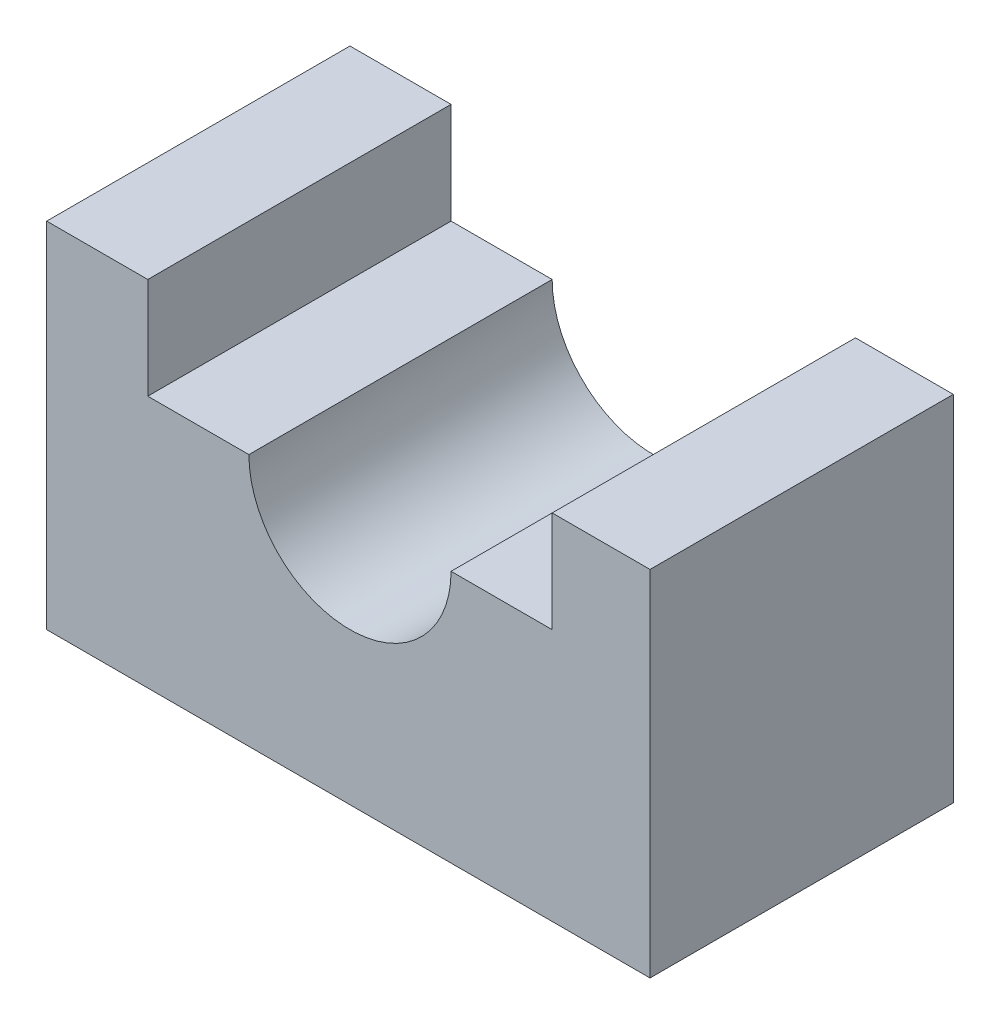
ISO-10303-21;
HEADER;
FILE_DESCRIPTION(('STEP AP214'),'2;1');
FILE_NAME('part.step','',(''),(''),'','','');
FILE_SCHEMA(('AUTOMOTIVE_DESIGN { 1 0 10303 214 1 1 1 1 }'));
ENDSEC;
DATA;
#1=APPLICATION_CONTEXT('core data for automotive mechanical design processes');
#2=APPLICATION_PROTOCOL_DEFINITION('international standard','automotive_design',2000,#1);
#3=PRODUCT_CONTEXT('',#1,'mechanical');
#4=PRODUCT('Part','Part','',(#3));
#5=PRODUCT_RELATED_PRODUCT_CATEGORY('part','',(#4));
#6=PRODUCT_DEFINITION_FORMATION('','',#4);
#7=PRODUCT_DEFINITION_CONTEXT('part definition',#1,'design');
#8=PRODUCT_DEFINITION('design','',#6,#7);
#9=PRODUCT_DEFINITION_SHAPE('','',#8);
#10=(LENGTH_UNIT() NAMED_UNIT(*) SI_UNIT(.MILLI.,.METRE.));
#11=(NAMED_UNIT(*) PLANE_ANGLE_UNIT() SI_UNIT($,.RADIAN.));
#12=(NAMED_UNIT(*) SI_UNIT($,.STERADIAN.) SOLID_ANGLE_UNIT());
#13=UNCERTAINTY_MEASURE_WITH_UNIT(LENGTH_MEASURE(1.E-05),#10,'distance_accuracy_value','');
#14=(GEOMETRIC_REPRESENTATION_CONTEXT(3) GLOBAL_UNCERTAINTY_ASSIGNED_CONTEXT((#13)) GLOBAL_UNIT_ASSIGNED_CONTEXT((#10,
#11,#12)) REPRESENTATION_CONTEXT('',''));
#15=CARTESIAN_POINT('',(0.,0.,0.));
#16=DIRECTION('',(0.,0.,1.));
#17=DIRECTION('',(1.,0.,0.));
#18=AXIS2_PLACEMENT_3D('',#15,#16,#17);
#19=CARTESIAN_POINT('',(-20.0000000000001,17.5,30.));
#20=DIRECTION('',(-1.,0.,0.));
#21=DIRECTION('',(0.,-1.,0.));
#22=AXIS2_PLACEMENT_3D('',#19,#20,#21);
#23=PLANE('',#22);
#24=DIRECTION('',(0.,1.,0.));
#25=VECTOR('',#24,1.);
#26=CARTESIAN_POINT('',(-20.0000000000001,17.5,0.));
#27=LINE('',#26,#25);
#28=CARTESIAN_POINT('',(-20.,7.49999999999999,0.));
#29=VERTEX_POINT('',#28);
#30=CARTESIAN_POINT('',(-20.0000000000001,17.5,0.));
#31=VERTEX_POINT('',#30);
#32=EDGE_CURVE('E141',#29,#31,#27,.T.);
#33=ORIENTED_EDGE('',*,*,#32,.T.);
#34=DIRECTION('',(0.,0.,-1.));
#35=VECTOR('',#34,1.);
#36=CARTESIAN_POINT('',(-20.0000000000001,17.5,30.));
#37=LINE('',#36,#35);
#38=CARTESIAN_POINT('',(-20.0000000000001,17.5,30.));
#39=VERTEX_POINT('',#38);
#40=EDGE_CURVE('E11',#39,#31,#37,.T.);
#41=ORIENTED_EDGE('',*,*,#40,.F.);
#42=DIRECTION('',(0.,1.,0.));
#43=VECTOR('',#42,1.);
#44=CARTESIAN_POINT('',(-20.0000000000001,17.5,30.));
#45=LINE('',#44,#43);
#46=CARTESIAN_POINT('',(-20.,7.49999999999999,30.));
#47=VERTEX_POINT('',#46);
#48=EDGE_CURVE('E161',#47,#39,#45,.T.);
#49=ORIENTED_EDGE('',*,*,#48,.F.);
#50=DIRECTION('',(0.,0.,-1.));
#51=VECTOR('',#50,1.);
#52=CARTESIAN_POINT('',(-20.,7.49999999999999,30.));
#53=LINE('',#52,#51);
#54=EDGE_CURVE('E137',#47,#29,#53,.T.);
#55=ORIENTED_EDGE('',*,*,#54,.T.);
#56=EDGE_LOOP('',(#33,#41,#49,#55));
#57=FACE_BOUND('',#56,.T.);
#58=ADVANCED_FACE('F33',(#57),#23,.F.);
#59=CARTESIAN_POINT('',(-30.,17.5,30.));
#60=DIRECTION('',(0.,-1.,0.));
#61=DIRECTION('',(0.,0.,-1.));
#62=AXIS2_PLACEMENT_3D('',#59,#60,#61);
#63=PLANE('',#62);
#64=DIRECTION('',(-1.,0.,0.));
#65=VECTOR('',#64,1.);
#66=CARTESIAN_POINT('',(-30.,17.5,0.));
#67=LINE('',#66,#65);
#68=CARTESIAN_POINT('',(-30.,17.5,0.));
#69=VERTEX_POINT('',#68);
#70=EDGE_CURVE('E144',#31,#69,#67,.T.);
#71=ORIENTED_EDGE('',*,*,#70,.T.);
#72=DIRECTION('',(0.,0.,-1.));
#73=VECTOR('',#72,1.);
#74=CARTESIAN_POINT('',(-30.,17.5,30.));
#75=LINE('',#74,#73);
#76=CARTESIAN_POINT('',(-30.,17.5,30.));
#77=VERTEX_POINT('',#76);
#78=EDGE_CURVE('E41',#77,#69,#75,.T.);
#79=ORIENTED_EDGE('',*,*,#78,.F.);
#80=DIRECTION('',(-1.,0.,0.));
#81=VECTOR('',#80,1.);
#82=CARTESIAN_POINT('',(-30.,17.5,30.));
#83=LINE('',#82,#81);
#84=EDGE_CURVE('E98',#39,#77,#83,.T.);
#85=ORIENTED_EDGE('',*,*,#84,.F.);
#86=ORIENTED_EDGE('',*,*,#40,.T.);
#87=EDGE_LOOP('',(#71,#79,#85,#86));
#88=FACE_BOUND('',#87,.T.);
#89=ADVANCED_FACE('F182',(#88),#63,.F.);
#90=CARTESIAN_POINT('',(-29.9999999999999,-17.5,30.));
#91=DIRECTION('',(1.,0.,0.));
#92=DIRECTION('',(0.,0.,-1.));
#93=AXIS2_PLACEMENT_3D('',#90,#91,#92);
#94=PLANE('',#93);
#95=DIRECTION('',(0.,-1.,0.));
#96=VECTOR('',#95,1.);
#97=CARTESIAN_POINT('',(-29.9999999999999,-17.5,0.));
#98=LINE('',#97,#96);
#99=CARTESIAN_POINT('',(-29.9999999999999,-17.5,0.));
#100=VERTEX_POINT('',#99);
#101=EDGE_CURVE('E147',#69,#100,#98,.T.);
#102=ORIENTED_EDGE('',*,*,#101,.T.);
#103=DIRECTION('',(0.,0.,-1.));
#104=VECTOR('',#103,1.);
#105=CARTESIAN_POINT('',(-29.9999999999999,-17.5,30.));
#106=LINE('',#105,#104);
#107=CARTESIAN_POINT('',(-29.9999999999999,-17.5,30.));
#108=VERTEX_POINT('',#107);
#109=EDGE_CURVE('E174',#108,#100,#106,.T.);
#110=ORIENTED_EDGE('',*,*,#109,.F.);
#111=DIRECTION('',(2.28919492035669E-13,-1.,0.));
#112=VECTOR('',#111,1.);
#113=CARTESIAN_POINT('',(-30.,17.5,30.));
#114=LINE('',#113,#112);
#115=EDGE_CURVE('E181',#77,#108,#114,.T.);
#116=ORIENTED_EDGE('',*,*,#115,.F.);
#117=ORIENTED_EDGE('',*,*,#78,.T.);
#118=EDGE_LOOP('',(#102,#110,#116,#117));
#119=FACE_BOUND('',#118,.T.);
#120=ADVANCED_FACE('F179',(#119),#94,.F.);
#121=CARTESIAN_POINT('',(-29.9999999999999,-17.5,30.));
#122=DIRECTION('',(0.,1.,0.));
#123=DIRECTION('',(0.,0.,1.));
#124=AXIS2_PLACEMENT_3D('',#121,#122,#123);
#125=PLANE('',#124);
#126=DIRECTION('',(1.,0.,0.));
#127=VECTOR('',#126,1.);
#128=CARTESIAN_POINT('',(-29.9999999999999,-17.5,0.));
#129=LINE('',#128,#127);
#130=CARTESIAN_POINT('',(29.6810238843591,-17.5,0.));
#131=VERTEX_POINT('',#130);
#132=EDGE_CURVE('E149',#100,#131,#129,.T.);
#133=ORIENTED_EDGE('',*,*,#132,.T.);
#134=DIRECTION('',(0.,0.,-1.));
#135=VECTOR('',#134,1.);
#136=CARTESIAN_POINT('',(29.6810238843591,-17.5,30.));
#137=LINE('',#136,#135);
#138=CARTESIAN_POINT('',(29.6810238843591,-17.5,30.));
#139=VERTEX_POINT('',#138);
#140=EDGE_CURVE('E171',#139,#131,#137,.T.);
#141=ORIENTED_EDGE('',*,*,#140,.F.);
#142=DIRECTION('',(1.,0.,0.));
#143=VECTOR('',#142,1.);
#144=CARTESIAN_POINT('',(-29.9999999999999,-17.5,30.));
#145=LINE('',#144,#143);
#146=EDGE_CURVE('E200',#108,#139,#145,.T.);
#147=ORIENTED_EDGE('',*,*,#146,.F.);
#148=ORIENTED_EDGE('',*,*,#109,.T.);
#149=EDGE_LOOP('',(#133,#141,#147,#148));
#150=FACE_BOUND('',#149,.T.);
#151=ADVANCED_FACE('F191',(#150),#125,.F.);
#152=CARTESIAN_POINT('',(29.6810238843591,16.9847044464521,30.));
#153=DIRECTION('',(-1.,0.,0.));
#154=DIRECTION('',(0.,0.,1.));
#155=AXIS2_PLACEMENT_3D('',#152,#153,#154);
#156=PLANE('',#155);
#157=DIRECTION('',(0.,1.,0.));
#158=VECTOR('',#157,1.);
#159=CARTESIAN_POINT('',(29.6810238843591,16.9847044464521,0.));
#160=LINE('',#159,#158);
#161=CARTESIAN_POINT('',(29.6810238843591,17.5000000000002,0.));
#162=VERTEX_POINT('',#161);
#163=EDGE_CURVE('E152',#131,#162,#160,.T.);
#164=ORIENTED_EDGE('',*,*,#163,.T.);
#165=DIRECTION('',(0.,0.,-1.));
#166=VECTOR('',#165,1.);
#167=CARTESIAN_POINT('',(29.6810238843591,17.5000000000002,30.));
#168=LINE('',#167,#166);
#169=CARTESIAN_POINT('',(29.6810238843591,17.5000000000002,30.));
#170=VERTEX_POINT('',#169);
#171=EDGE_CURVE('E168',#170,#162,#168,.T.);
#172=ORIENTED_EDGE('',*,*,#171,.F.);
#173=DIRECTION('',(0.,1.,0.));
#174=VECTOR('',#173,1.);
#175=CARTESIAN_POINT('',(29.6810238843591,-17.5,30.));
#176=LINE('',#175,#174);
#177=EDGE_CURVE('E197',#139,#170,#176,.T.);
#178=ORIENTED_EDGE('',*,*,#177,.F.);
#179=ORIENTED_EDGE('',*,*,#140,.T.);
#180=EDGE_LOOP('',(#164,#172,#178,#179));
#181=FACE_BOUND('',#180,.T.);
#182=ADVANCED_FACE('F195',(#181),#156,.F.);
#183=CARTESIAN_POINT('',(29.6810238843591,17.5000000000002,30.));
#184=DIRECTION('',(0.,-1.,0.));
#185=DIRECTION('',(1.,0.,0.));
#186=AXIS2_PLACEMENT_3D('',#183,#184,#185);
#187=PLANE('',#186);
#188=DIRECTION('',(-1.,0.,0.));
#189=VECTOR('',#188,1.);
#190=CARTESIAN_POINT('',(29.6810238843591,17.5000000000002,0.));
#191=LINE('',#190,#189);
#192=CARTESIAN_POINT('',(19.9999999999999,17.5000000000001,0.));
#193=VERTEX_POINT('',#192);
#194=EDGE_CURVE('E154',#162,#193,#191,.T.);
#195=ORIENTED_EDGE('',*,*,#194,.T.);
#196=DIRECTION('',(0.,0.,-1.));
#197=VECTOR('',#196,1.);
#198=CARTESIAN_POINT('',(19.9999999999999,17.5000000000001,30.));
#199=LINE('',#198,#197);
#200=CARTESIAN_POINT('',(19.9999999999999,17.5000000000001,30.));
#201=VERTEX_POINT('',#200);
#202=EDGE_CURVE('E165',#201,#193,#199,.T.);
#203=ORIENTED_EDGE('',*,*,#202,.F.);
#204=DIRECTION('',(-1.,0.,0.));
#205=VECTOR('',#204,1.);
#206=CARTESIAN_POINT('',(29.6810238843591,17.5000000000002,30.));
#207=LINE('',#206,#205);
#208=EDGE_CURVE('E199',#170,#201,#207,.T.);
#209=ORIENTED_EDGE('',*,*,#208,.F.);
#210=ORIENTED_EDGE('',*,*,#171,.T.);
#211=EDGE_LOOP('',(#195,#203,#209,#210));
#212=FACE_BOUND('',#211,.T.);
#213=ADVANCED_FACE('F215',(#212),#187,.F.);
#214=CARTESIAN_POINT('',(19.9999999999999,17.5000000000001,30.));
#215=DIRECTION('',(1.,0.,0.));
#216=DIRECTION('',(0.,1.,0.));
#217=AXIS2_PLACEMENT_3D('',#214,#215,#216);
#218=PLANE('',#217);
#219=DIRECTION('',(0.,-1.,0.));
#220=VECTOR('',#219,1.);
#221=CARTESIAN_POINT('',(19.9999999999999,17.5000000000001,0.));
#222=LINE('',#221,#220);
#223=CARTESIAN_POINT('',(20.,7.50000000000013,0.));
#224=VERTEX_POINT('',#223);
#225=EDGE_CURVE('E156',#193,#224,#222,.T.);
#226=ORIENTED_EDGE('',*,*,#225,.T.);
#227=DIRECTION('',(0.,0.,-1.));
#228=VECTOR('',#227,1.);
#229=CARTESIAN_POINT('',(20.,7.50000000000013,30.));
#230=LINE('',#229,#228);
#231=CARTESIAN_POINT('',(20.,7.50000000000013,30.));
#232=VERTEX_POINT('',#231);
#233=EDGE_CURVE('E132',#232,#224,#230,.T.);
#234=ORIENTED_EDGE('',*,*,#233,.F.);
#235=DIRECTION('',(0.,-1.,0.));
#236=VECTOR('',#235,1.);
#237=CARTESIAN_POINT('',(19.9999999999999,17.5000000000001,30.));
#238=LINE('',#237,#236);
#239=EDGE_CURVE('E123',#201,#232,#238,.T.);
#240=ORIENTED_EDGE('',*,*,#239,.F.);
#241=ORIENTED_EDGE('',*,*,#202,.T.);
#242=EDGE_LOOP('',(#226,#234,#240,#241));
#243=FACE_BOUND('',#242,.T.);
#244=ADVANCED_FACE('F212',(#243),#218,.F.);
#245=CARTESIAN_POINT('',(20.,7.50000000000013,30.));
#246=DIRECTION('',(0.,-1.,0.));
#247=DIRECTION('',(1.,0.,0.));
#248=AXIS2_PLACEMENT_3D('',#245,#246,#247);
#249=PLANE('',#248);
#250=DIRECTION('',(-1.,0.,0.));
#251=VECTOR('',#250,1.);
#252=CARTESIAN_POINT('',(20.,7.50000000000013,0.));
#253=LINE('',#252,#251);
#254=CARTESIAN_POINT('',(9.99999999999997,7.50000000000006,0.));
#255=VERTEX_POINT('',#254);
#256=EDGE_CURVE('E131',#224,#255,#253,.T.);
#257=ORIENTED_EDGE('',*,*,#256,.T.);
#258=DIRECTION('',(0.,0.,-1.));
#259=VECTOR('',#258,1.);
#260=CARTESIAN_POINT('',(9.99999999999997,7.50000000000006,30.));
#261=LINE('',#260,#259);
#262=CARTESIAN_POINT('',(9.99999999999997,7.50000000000006,30.));
#263=VERTEX_POINT('',#262);
#264=EDGE_CURVE('E128',#263,#255,#261,.T.);
#265=ORIENTED_EDGE('',*,*,#264,.F.);
#266=DIRECTION('',(-1.,0.,0.));
#267=VECTOR('',#266,1.);
#268=CARTESIAN_POINT('',(20.,7.50000000000013,30.));
#269=LINE('',#268,#267);
#270=EDGE_CURVE('E117',#232,#263,#269,.T.);
#271=ORIENTED_EDGE('',*,*,#270,.F.);
#272=ORIENTED_EDGE('',*,*,#233,.T.);
#273=EDGE_LOOP('',(#257,#265,#271,#272));
#274=FACE_BOUND('',#273,.T.);
#275=ADVANCED_FACE('F129',(#274),#249,.F.);
#276=CARTESIAN_POINT('',(0.,7.49999999999999,30.));
#277=DIRECTION('',(0.,0.,-1.));
#278=DIRECTION('',(-1.,0.,0.));
#279=AXIS2_PLACEMENT_3D('',#276,#277,#278);
#280=CYLINDRICAL_SURFACE('',#279,9.99999999999999);
#281=CARTESIAN_POINT('',(0.,7.49999999999999,0.));
#282=DIRECTION('',(0.,0.,-1.));
#283=DIRECTION('',(1.,0.,0.));
#284=AXIS2_PLACEMENT_3D('',#281,#282,#283);
#285=CIRCLE('',#284,9.99999999999999);
#286=CARTESIAN_POINT('',(-10.,7.5,0.));
#287=VERTEX_POINT('',#286);
#288=EDGE_CURVE('E84',#255,#287,#285,.T.);
#289=ORIENTED_EDGE('',*,*,#288,.T.);
#290=DIRECTION('',(0.,0.,-1.));
#291=VECTOR('',#290,1.);
#292=CARTESIAN_POINT('',(-10.,7.5,30.));
#293=LINE('',#292,#291);
#294=CARTESIAN_POINT('',(-10.,7.5,30.));
#295=VERTEX_POINT('',#294);
#296=EDGE_CURVE('E133',#295,#287,#293,.T.);
#297=ORIENTED_EDGE('',*,*,#296,.F.);
#298=CARTESIAN_POINT('',(0.,7.49999999999999,30.));
#299=DIRECTION('',(0.,0.,-1.));
#300=DIRECTION('',(1.,0.,0.));
#301=AXIS2_PLACEMENT_3D('',#298,#299,#300);
#302=CIRCLE('',#301,9.99999999999999);
#303=EDGE_CURVE('E121',#263,#295,#302,.T.);
#304=ORIENTED_EDGE('',*,*,#303,.F.);
#305=ORIENTED_EDGE('',*,*,#264,.T.);
#306=EDGE_LOOP('',(#289,#297,#304,#305));
#307=FACE_BOUND('',#306,.T.);
#308=ADVANCED_FACE('F135',(#307),#280,.F.);
#309=CARTESIAN_POINT('',(-20.,7.49999999999999,30.));
#310=DIRECTION('',(0.,-1.,0.));
#311=DIRECTION('',(0.,0.,-1.));
#312=AXIS2_PLACEMENT_3D('',#309,#310,#311);
#313=PLANE('',#312);
#314=DIRECTION('',(-1.,0.,0.));
#315=VECTOR('',#314,1.);
#316=CARTESIAN_POINT('',(-20.,7.49999999999999,0.));
#317=LINE('',#316,#315);
#318=EDGE_CURVE('E90',#287,#29,#317,.T.);
#319=ORIENTED_EDGE('',*,*,#318,.T.);
#320=ORIENTED_EDGE('',*,*,#54,.F.);
#321=DIRECTION('',(-1.,0.,0.));
#322=VECTOR('',#321,1.);
#323=CARTESIAN_POINT('',(-20.,7.49999999999999,30.));
#324=LINE('',#323,#322);
#325=EDGE_CURVE('E49',#295,#47,#324,.T.);
#326=ORIENTED_EDGE('',*,*,#325,.F.);
#327=ORIENTED_EDGE('',*,*,#296,.T.);
#328=EDGE_LOOP('',(#319,#320,#326,#327));
#329=FACE_BOUND('',#328,.T.);
#330=ADVANCED_FACE('F209',(#329),#313,.F.);
#331=CARTESIAN_POINT('',(0.,7.49999999999999,30.));
#332=DIRECTION('',(0.,0.,1.));
#333=DIRECTION('',(1.,0.,0.));
#334=AXIS2_PLACEMENT_3D('',#331,#332,#333);
#335=PLANE('',#334);
#336=ORIENTED_EDGE('',*,*,#48,.T.);
#337=ORIENTED_EDGE('',*,*,#84,.T.);
#338=ORIENTED_EDGE('',*,*,#115,.T.);
#339=ORIENTED_EDGE('',*,*,#146,.T.);
#340=ORIENTED_EDGE('',*,*,#177,.T.);
#341=ORIENTED_EDGE('',*,*,#208,.T.);
#342=ORIENTED_EDGE('',*,*,#239,.T.);
#343=ORIENTED_EDGE('',*,*,#270,.T.);
#344=ORIENTED_EDGE('',*,*,#303,.T.);
#345=ORIENTED_EDGE('',*,*,#325,.T.);
#346=EDGE_LOOP('',(#336,#337,#338,#339,#340,#341,#342,#343,#344,#345));
#347=FACE_BOUND('',#346,.T.);
#348=ADVANCED_FACE('F119',(#347),#335,.T.);
#349=CARTESIAN_POINT('',(0.,7.49999999999999,0.));
#350=DIRECTION('',(0.,0.,1.));
#351=DIRECTION('',(1.,0.,0.));
#352=AXIS2_PLACEMENT_3D('',#349,#350,#351);
#353=PLANE('',#352);
#354=ORIENTED_EDGE('',*,*,#32,.F.);
#355=ORIENTED_EDGE('',*,*,#318,.F.);
#356=ORIENTED_EDGE('',*,*,#288,.F.);
#357=ORIENTED_EDGE('',*,*,#256,.F.);
#358=ORIENTED_EDGE('',*,*,#225,.F.);
#359=ORIENTED_EDGE('',*,*,#194,.F.);
#360=ORIENTED_EDGE('',*,*,#163,.F.);
#361=ORIENTED_EDGE('',*,*,#132,.F.);
#362=ORIENTED_EDGE('',*,*,#101,.F.);
#363=ORIENTED_EDGE('',*,*,#70,.F.);
#364=EDGE_LOOP('',(#354,#355,#356,#357,#358,#359,#360,#361,#362,#363));
#365=FACE_BOUND('',#364,.T.);
#366=ADVANCED_FACE('F186',(#365),#353,.F.);
#367=CLOSED_SHELL('',(#58,#89,#120,#151,#182,#213,#244,#275,#308,#330,#348,#366));
#368=MANIFOLD_SOLID_BREP('B2',#367);
#369=ADVANCED_BREP_SHAPE_REPRESENTATION('',(#18,#368),#14);
#370=SHAPE_DEFINITION_REPRESENTATION(#9,#369);
ENDSEC;
END-ISO-10303-21;
